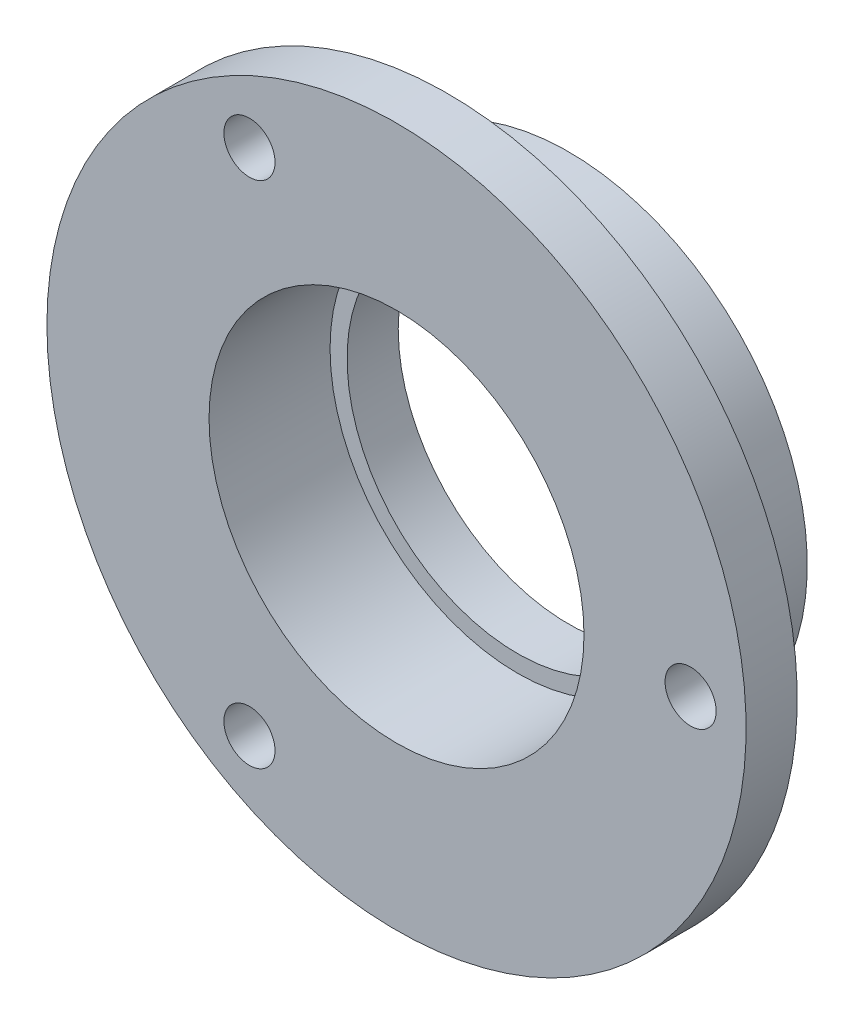
ISO-10303-21;
HEADER;
FILE_DESCRIPTION(('STEP AP214'),'2;1');
FILE_NAME('part.step','',(''),(''),'','','');
FILE_SCHEMA(('AUTOMOTIVE_DESIGN { 1 0 10303 214 1 1 1 1 }'));
ENDSEC;
DATA;
#1=APPLICATION_CONTEXT('core data for automotive mechanical design processes');
#2=APPLICATION_PROTOCOL_DEFINITION('international standard','automotive_design',2000,#1);
#3=PRODUCT_CONTEXT('',#1,'mechanical');
#4=PRODUCT('Part','Part','',(#3));
#5=PRODUCT_RELATED_PRODUCT_CATEGORY('part','',(#4));
#6=PRODUCT_DEFINITION_FORMATION('','',#4);
#7=PRODUCT_DEFINITION_CONTEXT('part definition',#1,'design');
#8=PRODUCT_DEFINITION('design','',#6,#7);
#9=PRODUCT_DEFINITION_SHAPE('','',#8);
#10=(LENGTH_UNIT() NAMED_UNIT(*) SI_UNIT(.MILLI.,.METRE.));
#11=(NAMED_UNIT(*) PLANE_ANGLE_UNIT() SI_UNIT($,.RADIAN.));
#12=(NAMED_UNIT(*) SI_UNIT($,.STERADIAN.) SOLID_ANGLE_UNIT());
#13=UNCERTAINTY_MEASURE_WITH_UNIT(LENGTH_MEASURE(1.E-05),#10,'distance_accuracy_value','');
#14=(GEOMETRIC_REPRESENTATION_CONTEXT(3) GLOBAL_UNCERTAINTY_ASSIGNED_CONTEXT((#13)) GLOBAL_UNIT_ASSIGNED_CONTEXT((#10,
#11,#12)) REPRESENTATION_CONTEXT('',''));
#15=CARTESIAN_POINT('',(0.,0.,0.));
#16=DIRECTION('',(0.,0.,1.));
#17=DIRECTION('',(1.,0.,0.));
#18=AXIS2_PLACEMENT_3D('',#15,#16,#17);
#19=CARTESIAN_POINT('',(11.0000001639128,0.,0.));
#20=DIRECTION('',(0.,0.,1.));
#21=DIRECTION('',(1.,0.,0.));
#22=AXIS2_PLACEMENT_3D('',#19,#20,#21);
#23=PLANE('',#22);
#24=CARTESIAN_POINT('',(0.,0.,0.));
#25=DIRECTION('',(0.,0.,1.));
#26=DIRECTION('',(1.,0.,0.));
#27=AXIS2_PLACEMENT_3D('',#24,#25,#26);
#28=CIRCLE('',#27,11.0000001639128);
#29=CARTESIAN_POINT('',(-11.0000001639128,0.,0.));
#30=VERTEX_POINT('',#29);
#31=EDGE_CURVE('E123',#30,#30,#28,.T.);
#32=ORIENTED_EDGE('',*,*,#31,.F.);
#33=EDGE_LOOP('',(#32));
#34=FACE_BOUND('',#33,.T.);
#35=CARTESIAN_POINT('',(-8.62772792658807,-14.9436631227314,0.));
#36=DIRECTION('',(0.,0.,-1.));
#37=DIRECTION('',(-1.,0.,0.));
#38=AXIS2_PLACEMENT_3D('',#35,#36,#37);
#39=CIRCLE('',#38,1.5);
#40=CARTESIAN_POINT('',(-7.12772792658807,-14.9436631227314,0.));
#41=VERTEX_POINT('',#40);
#42=EDGE_CURVE('E115',#41,#41,#39,.T.);
#43=ORIENTED_EDGE('',*,*,#42,.T.);
#44=EDGE_LOOP('',(#43));
#45=FACE_BOUND('',#44,.T.);
#46=CARTESIAN_POINT('',(-8.62772792658807,14.9436631227314,0.));
#47=DIRECTION('',(0.,0.,-1.));
#48=DIRECTION('',(-1.,0.,0.));
#49=AXIS2_PLACEMENT_3D('',#46,#47,#48);
#50=CIRCLE('',#49,1.5);
#51=CARTESIAN_POINT('',(-7.12772792658807,14.9436631227314,0.));
#52=VERTEX_POINT('',#51);
#53=EDGE_CURVE('E127',#52,#52,#50,.T.);
#54=ORIENTED_EDGE('',*,*,#53,.T.);
#55=EDGE_LOOP('',(#54));
#56=FACE_BOUND('',#55,.T.);
#57=CARTESIAN_POINT('',(17.2554558531761,0.,0.));
#58=DIRECTION('',(0.,0.,-1.));
#59=DIRECTION('',(-1.,0.,0.));
#60=AXIS2_PLACEMENT_3D('',#57,#58,#59);
#61=CIRCLE('',#60,1.5);
#62=CARTESIAN_POINT('',(18.7554558531761,0.,0.));
#63=VERTEX_POINT('',#62);
#64=EDGE_CURVE('E83',#63,#63,#61,.T.);
#65=ORIENTED_EDGE('',*,*,#64,.T.);
#66=EDGE_LOOP('',(#65));
#67=FACE_BOUND('',#66,.T.);
#68=CARTESIAN_POINT('',(0.,0.,0.));
#69=DIRECTION('',(0.,0.,1.));
#70=DIRECTION('',(1.,0.,0.));
#71=AXIS2_PLACEMENT_3D('',#68,#69,#70);
#72=CIRCLE('',#71,20.510911497736);
#73=CARTESIAN_POINT('',(-20.510911497736,0.,0.));
#74=VERTEX_POINT('',#73);
#75=EDGE_CURVE('E50',#74,#74,#72,.T.);
#76=ORIENTED_EDGE('',*,*,#75,.T.);
#77=EDGE_LOOP('',(#76));
#78=FACE_BOUND('',#77,.T.);
#79=ADVANCED_FACE('F40',(#34,#45,#56,#67,#78),#23,.T.);
#80=CARTESIAN_POINT('',(0.,0.,-1.50000002235175));
#81=DIRECTION('',(0.,0.,1.));
#82=DIRECTION('',(1.,0.,0.));
#83=AXIS2_PLACEMENT_3D('',#80,#81,#82);
#84=CYLINDRICAL_SURFACE('',#83,20.510911497736);
#85=ORIENTED_EDGE('',*,*,#75,.F.);
#86=DIRECTION('',(0.,0.,-1.));
#87=VECTOR('',#86,1.);
#88=CARTESIAN_POINT('',(-20.510911497736,0.,-1.50000002235175));
#89=LINE('',#88,#87);
#90=CARTESIAN_POINT('',(-20.510911497736,0.,-3.00000004470349));
#91=VERTEX_POINT('',#90);
#92=EDGE_CURVE('E11',#74,#91,#89,.T.);
#93=ORIENTED_EDGE('',*,*,#92,.T.);
#94=CARTESIAN_POINT('',(0.,0.,-3.00000004470349));
#95=DIRECTION('',(0.,0.,1.));
#96=DIRECTION('',(1.,0.,0.));
#97=AXIS2_PLACEMENT_3D('',#94,#95,#96);
#98=CIRCLE('',#97,20.510911497736);
#99=EDGE_CURVE('E102',#91,#91,#98,.T.);
#100=ORIENTED_EDGE('',*,*,#99,.T.);
#101=ORIENTED_EDGE('',*,*,#92,.F.);
#102=EDGE_LOOP('',(#85,#93,#100,#101));
#103=FACE_BOUND('',#102,.T.);
#104=ADVANCED_FACE('F147',(#103),#84,.T.);
#105=CARTESIAN_POINT('',(20.510911497736,0.,-3.00000004470349));
#106=DIRECTION('',(0.,0.,-1.));
#107=DIRECTION('',(0.,-1.,0.));
#108=AXIS2_PLACEMENT_3D('',#105,#106,#107);
#109=PLANE('',#108);
#110=CARTESIAN_POINT('',(0.,0.,-3.00000004470348));
#111=DIRECTION('',(0.,0.,1.));
#112=DIRECTION('',(1.,0.,0.));
#113=AXIS2_PLACEMENT_3D('',#110,#111,#112);
#114=CIRCLE('',#113,14.0000002086163);
#115=CARTESIAN_POINT('',(-14.0000002086163,0.,-3.00000004470348));
#116=VERTEX_POINT('',#115);
#117=EDGE_CURVE('E99',#116,#116,#114,.T.);
#118=ORIENTED_EDGE('',*,*,#117,.T.);
#119=EDGE_LOOP('',(#118));
#120=FACE_BOUND('',#119,.T.);
#121=CARTESIAN_POINT('',(-8.62772792658807,-14.9436631227314,-3.00000004470349));
#122=DIRECTION('',(0.,0.,1.));
#123=DIRECTION('',(-1.,0.,0.));
#124=AXIS2_PLACEMENT_3D('',#121,#122,#123);
#125=CIRCLE('',#124,1.5);
#126=CARTESIAN_POINT('',(-7.12772792658807,-14.9436631227314,-3.00000004470348));
#127=VERTEX_POINT('',#126);
#128=EDGE_CURVE('E116',#127,#127,#125,.T.);
#129=ORIENTED_EDGE('',*,*,#128,.T.);
#130=EDGE_LOOP('',(#129));
#131=FACE_BOUND('',#130,.T.);
#132=CARTESIAN_POINT('',(-8.62772792658807,14.9436631227314,-3.00000004470349));
#133=DIRECTION('',(0.,0.,1.));
#134=DIRECTION('',(-1.,0.,0.));
#135=AXIS2_PLACEMENT_3D('',#132,#133,#134);
#136=CIRCLE('',#135,1.5);
#137=CARTESIAN_POINT('',(-7.12772792658807,14.9436631227314,-3.00000004470348));
#138=VERTEX_POINT('',#137);
#139=EDGE_CURVE('E118',#138,#138,#136,.T.);
#140=ORIENTED_EDGE('',*,*,#139,.T.);
#141=EDGE_LOOP('',(#140));
#142=FACE_BOUND('',#141,.T.);
#143=CARTESIAN_POINT('',(17.2554558531761,0.,-3.00000004470349));
#144=DIRECTION('',(0.,0.,1.));
#145=DIRECTION('',(-1.,0.,0.));
#146=AXIS2_PLACEMENT_3D('',#143,#144,#145);
#147=CIRCLE('',#146,1.5);
#148=CARTESIAN_POINT('',(18.7554558531761,0.,-3.00000004470348));
#149=VERTEX_POINT('',#148);
#150=EDGE_CURVE('E111',#149,#149,#147,.T.);
#151=ORIENTED_EDGE('',*,*,#150,.T.);
#152=EDGE_LOOP('',(#151));
#153=FACE_BOUND('',#152,.T.);
#154=ORIENTED_EDGE('',*,*,#99,.F.);
#155=EDGE_LOOP('',(#154));
#156=FACE_BOUND('',#155,.T.);
#157=ADVANCED_FACE('F105',(#120,#131,#142,#153,#156),#109,.T.);
#158=CARTESIAN_POINT('',(0.,0.,-6.55000002235174));
#159=DIRECTION('',(0.,0.,1.));
#160=DIRECTION('',(1.,0.,0.));
#161=AXIS2_PLACEMENT_3D('',#158,#159,#160);
#162=CYLINDRICAL_SURFACE('',#161,14.0000002086163);
#163=ORIENTED_EDGE('',*,*,#117,.F.);
#164=DIRECTION('',(0.,0.,-1.));
#165=VECTOR('',#164,1.);
#166=CARTESIAN_POINT('',(-14.0000002086163,0.,-6.55000002235174));
#167=LINE('',#166,#165);
#168=CARTESIAN_POINT('',(-14.0000002086163,0.,-10.1));
#169=VERTEX_POINT('',#168);
#170=EDGE_CURVE('E96',#116,#169,#167,.T.);
#171=ORIENTED_EDGE('',*,*,#170,.T.);
#172=CARTESIAN_POINT('',(0.,0.,-10.1));
#173=DIRECTION('',(0.,0.,1.));
#174=DIRECTION('',(1.,0.,0.));
#175=AXIS2_PLACEMENT_3D('',#172,#173,#174);
#176=CIRCLE('',#175,14.0000002086163);
#177=EDGE_CURVE('E101',#169,#169,#176,.T.);
#178=ORIENTED_EDGE('',*,*,#177,.T.);
#179=ORIENTED_EDGE('',*,*,#170,.F.);
#180=EDGE_LOOP('',(#163,#171,#178,#179));
#181=FACE_BOUND('',#180,.T.);
#182=ADVANCED_FACE('F98',(#181),#162,.T.);
#183=CARTESIAN_POINT('',(14.0000002086163,0.,-10.1));
#184=DIRECTION('',(0.,0.,-1.));
#185=DIRECTION('',(0.,-1.,0.));
#186=AXIS2_PLACEMENT_3D('',#183,#184,#185);
#187=PLANE('',#186);
#188=CARTESIAN_POINT('',(0.,0.,-10.1));
#189=DIRECTION('',(0.,0.,-1.));
#190=DIRECTION('',(-1.,0.,0.));
#191=AXIS2_PLACEMENT_3D('',#188,#189,#190);
#192=CIRCLE('',#191,10.0000001639128);
#193=CARTESIAN_POINT('',(-10.0000001639128,0.,-10.1));
#194=VERTEX_POINT('',#193);
#195=EDGE_CURVE('E185',#194,#194,#192,.F.);
#196=ORIENTED_EDGE('',*,*,#195,.T.);
#197=EDGE_LOOP('',(#196));
#198=FACE_BOUND('',#197,.T.);
#199=ORIENTED_EDGE('',*,*,#177,.F.);
#200=EDGE_LOOP('',(#199));
#201=FACE_BOUND('',#200,.T.);
#202=ADVANCED_FACE('F161',(#198,#201),#187,.T.);
#203=CARTESIAN_POINT('',(4.05000016391277,0.,-7.1));
#204=DIRECTION('',(0.,0.,1.));
#205=DIRECTION('',(1.,0.,0.));
#206=AXIS2_PLACEMENT_3D('',#203,#204,#205);
#207=PLANE('',#206);
#208=CARTESIAN_POINT('',(0.,0.,-7.1));
#209=DIRECTION('',(0.,0.,1.));
#210=DIRECTION('',(1.,0.,0.));
#211=AXIS2_PLACEMENT_3D('',#208,#209,#210);
#212=CIRCLE('',#211,10.0000001639128);
#213=CARTESIAN_POINT('',(10.0000001639128,0.,-7.1));
#214=VERTEX_POINT('',#213);
#215=EDGE_CURVE('E183',#214,#214,#212,.T.);
#216=ORIENTED_EDGE('',*,*,#215,.F.);
#217=EDGE_LOOP('',(#216));
#218=FACE_BOUND('',#217,.T.);
#219=CARTESIAN_POINT('',(0.,0.,-7.1));
#220=DIRECTION('',(0.,0.,1.));
#221=DIRECTION('',(1.,0.,0.));
#222=AXIS2_PLACEMENT_3D('',#219,#220,#221);
#223=CIRCLE('',#222,11.0000001639128);
#224=CARTESIAN_POINT('',(-11.0000001639128,0.,-7.1));
#225=VERTEX_POINT('',#224);
#226=EDGE_CURVE('E44',#225,#225,#223,.T.);
#227=ORIENTED_EDGE('',*,*,#226,.T.);
#228=EDGE_LOOP('',(#227));
#229=FACE_BOUND('',#228,.T.);
#230=ADVANCED_FACE('F141',(#218,#229),#207,.T.);
#231=CARTESIAN_POINT('',(0.,0.,-3.55));
#232=DIRECTION('',(0.,0.,1.));
#233=DIRECTION('',(1.,0.,0.));
#234=AXIS2_PLACEMENT_3D('',#231,#232,#233);
#235=CYLINDRICAL_SURFACE('',#234,11.0000001639128);
#236=ORIENTED_EDGE('',*,*,#31,.T.);
#237=DIRECTION('',(0.,0.,-1.));
#238=VECTOR('',#237,1.);
#239=CARTESIAN_POINT('',(-11.0000001639128,0.,-3.55));
#240=LINE('',#239,#238);
#241=EDGE_CURVE('E135',#30,#225,#240,.T.);
#242=ORIENTED_EDGE('',*,*,#241,.T.);
#243=ORIENTED_EDGE('',*,*,#226,.F.);
#244=ORIENTED_EDGE('',*,*,#241,.F.);
#245=EDGE_LOOP('',(#236,#242,#243,#244));
#246=FACE_BOUND('',#245,.T.);
#247=ADVANCED_FACE('F142',(#246),#235,.F.);
#248=CARTESIAN_POINT('',(-8.62772792658807,-14.9436631227314,-3.00000004470348));
#249=DIRECTION('',(0.,0.,1.));
#250=DIRECTION('',(-1.,0.,0.));
#251=AXIS2_PLACEMENT_3D('',#248,#249,#250);
#252=CYLINDRICAL_SURFACE('',#251,1.5);
#253=ORIENTED_EDGE('',*,*,#128,.F.);
#254=DIRECTION('',(0.,0.,1.));
#255=VECTOR('',#254,1.);
#256=CARTESIAN_POINT('',(-7.12772792658807,-14.9436631227314,-3.00000004470348));
#257=LINE('',#256,#255);
#258=EDGE_CURVE('E113',#127,#41,#257,.T.);
#259=ORIENTED_EDGE('',*,*,#258,.T.);
#260=ORIENTED_EDGE('',*,*,#42,.F.);
#261=ORIENTED_EDGE('',*,*,#258,.F.);
#262=EDGE_LOOP('',(#253,#259,#260,#261));
#263=FACE_BOUND('',#262,.T.);
#264=ADVANCED_FACE('F42',(#263),#252,.F.);
#265=CARTESIAN_POINT('',(-8.62772792658807,14.9436631227314,-3.00000004470348));
#266=DIRECTION('',(0.,0.,1.));
#267=DIRECTION('',(-1.,0.,0.));
#268=AXIS2_PLACEMENT_3D('',#265,#266,#267);
#269=CYLINDRICAL_SURFACE('',#268,1.5);
#270=ORIENTED_EDGE('',*,*,#139,.F.);
#271=DIRECTION('',(0.,0.,1.));
#272=VECTOR('',#271,1.);
#273=CARTESIAN_POINT('',(-7.12772792658807,14.9436631227314,-3.00000004470348));
#274=LINE('',#273,#272);
#275=EDGE_CURVE('E121',#138,#52,#274,.T.);
#276=ORIENTED_EDGE('',*,*,#275,.T.);
#277=ORIENTED_EDGE('',*,*,#53,.F.);
#278=ORIENTED_EDGE('',*,*,#275,.F.);
#279=EDGE_LOOP('',(#270,#276,#277,#278));
#280=FACE_BOUND('',#279,.T.);
#281=ADVANCED_FACE('F167',(#280),#269,.F.);
#282=CARTESIAN_POINT('',(17.2554558531761,0.,-3.00000004470348));
#283=DIRECTION('',(0.,0.,1.));
#284=DIRECTION('',(-1.,0.,0.));
#285=AXIS2_PLACEMENT_3D('',#282,#283,#284);
#286=CYLINDRICAL_SURFACE('',#285,1.5);
#287=ORIENTED_EDGE('',*,*,#150,.F.);
#288=DIRECTION('',(0.,0.,1.));
#289=VECTOR('',#288,1.);
#290=CARTESIAN_POINT('',(18.7554558531761,0.,-3.00000004470348));
#291=LINE('',#290,#289);
#292=EDGE_CURVE('E78',#149,#63,#291,.T.);
#293=ORIENTED_EDGE('',*,*,#292,.T.);
#294=ORIENTED_EDGE('',*,*,#64,.F.);
#295=ORIENTED_EDGE('',*,*,#292,.F.);
#296=EDGE_LOOP('',(#287,#293,#294,#295));
#297=FACE_BOUND('',#296,.T.);
#298=ADVANCED_FACE('F169',(#297),#286,.F.);
#299=CARTESIAN_POINT('',(0.,0.,-10.101));
#300=DIRECTION('',(0.,0.,1.));
#301=DIRECTION('',(1.,0.,0.));
#302=AXIS2_PLACEMENT_3D('',#299,#300,#301);
#303=CYLINDRICAL_SURFACE('',#302,10.0000001639128);
#304=ORIENTED_EDGE('',*,*,#195,.F.);
#305=EDGE_LOOP('',(#304));
#306=FACE_BOUND('',#305,.T.);
#307=ORIENTED_EDGE('',*,*,#215,.T.);
#308=EDGE_LOOP('',(#307));
#309=FACE_BOUND('',#308,.T.);
#310=ADVANCED_FACE('F173',(#306,#309),#303,.F.);
#311=CLOSED_SHELL('',(#79,#104,#157,#182,#202,#230,#247,#264,#281,#298,#310));
#312=MANIFOLD_SOLID_BREP('B2',#311);
#313=ADVANCED_BREP_SHAPE_REPRESENTATION('',(#18,#312),#14);
#314=SHAPE_DEFINITION_REPRESENTATION(#9,#313);
ENDSEC;
END-ISO-10303-21;
